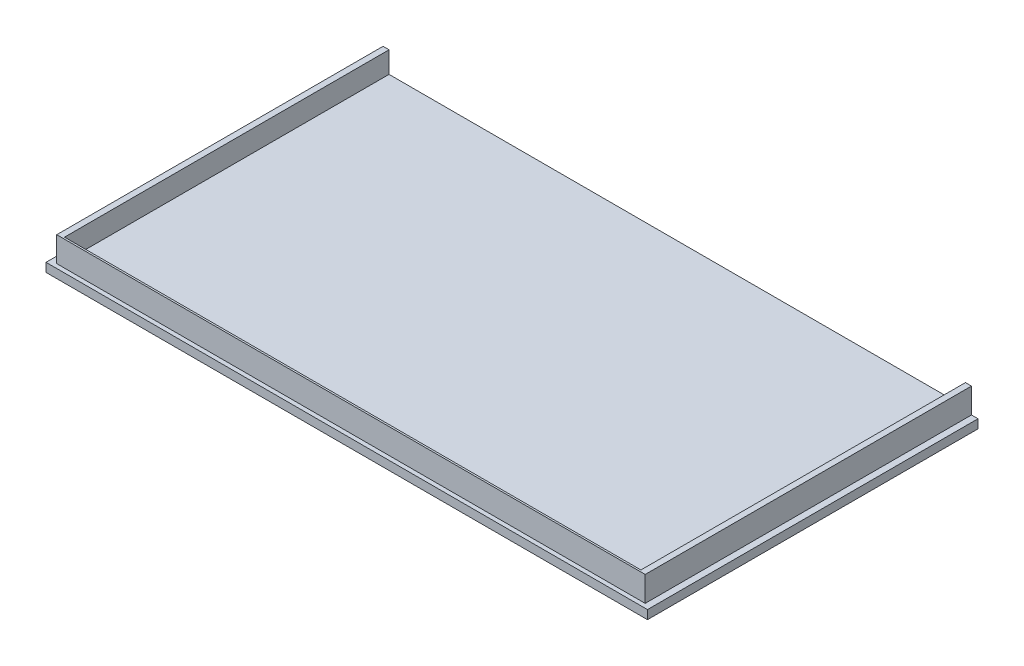
ISO-10303-21;
HEADER;
FILE_DESCRIPTION(('STEP AP214'),'2;1');
FILE_NAME('part.step','',(''),(''),'','','');
FILE_SCHEMA(('AUTOMOTIVE_DESIGN { 1 0 10303 214 1 1 1 1 }'));
ENDSEC;
DATA;
#1=APPLICATION_CONTEXT('core data for automotive mechanical design processes');
#2=APPLICATION_PROTOCOL_DEFINITION('international standard','automotive_design',2000,#1);
#3=PRODUCT_CONTEXT('',#1,'mechanical');
#4=PRODUCT('Part','Part','',(#3));
#5=PRODUCT_RELATED_PRODUCT_CATEGORY('part','',(#4));
#6=PRODUCT_DEFINITION_FORMATION('','',#4);
#7=PRODUCT_DEFINITION_CONTEXT('part definition',#1,'design');
#8=PRODUCT_DEFINITION('design','',#6,#7);
#9=PRODUCT_DEFINITION_SHAPE('','',#8);
#10=(LENGTH_UNIT() NAMED_UNIT(*) SI_UNIT(.MILLI.,.METRE.));
#11=(NAMED_UNIT(*) PLANE_ANGLE_UNIT() SI_UNIT($,.RADIAN.));
#12=(NAMED_UNIT(*) SI_UNIT($,.STERADIAN.) SOLID_ANGLE_UNIT());
#13=UNCERTAINTY_MEASURE_WITH_UNIT(LENGTH_MEASURE(1.E-05),#10,'distance_accuracy_value','');
#14=(GEOMETRIC_REPRESENTATION_CONTEXT(3) GLOBAL_UNCERTAINTY_ASSIGNED_CONTEXT((#13)) GLOBAL_UNIT_ASSIGNED_CONTEXT((#10,
#11,#12)) REPRESENTATION_CONTEXT('',''));
#15=CARTESIAN_POINT('',(0.,0.,0.));
#16=DIRECTION('',(0.,0.,1.));
#17=DIRECTION('',(1.,0.,0.));
#18=AXIS2_PLACEMENT_3D('',#15,#16,#17);
#19=CARTESIAN_POINT('',(-98.176553254438,21.,77.3984467455621));
#20=DIRECTION('',(1.,0.,0.));
#21=DIRECTION('',(0.,0.,-1.));
#22=AXIS2_PLACEMENT_3D('',#19,#20,#21);
#23=PLANE('',#22);
#24=DIRECTION('',(0.,-1.,0.));
#25=VECTOR('',#24,1.);
#26=CARTESIAN_POINT('',(-98.176553254438,21.,77.3984467455621));
#27=LINE('',#26,#25);
#28=CARTESIAN_POINT('',(-98.176553254438,3.5,77.3984467455621));
#29=VERTEX_POINT('',#28);
#30=CARTESIAN_POINT('',(-98.176553254438,0.,77.3984467455621));
#31=VERTEX_POINT('',#30);
#32=EDGE_CURVE('E41',#29,#31,#27,.T.);
#33=ORIENTED_EDGE('',*,*,#32,.F.);
#34=DIRECTION('',(0.,0.,1.));
#35=VECTOR('',#34,1.);
#36=CARTESIAN_POINT('',(-98.176553254438,3.5,77.3984467455621));
#37=LINE('',#36,#35);
#38=CARTESIAN_POINT('',(-98.176553254438,3.5,-54.4815532544379));
#39=VERTEX_POINT('',#38);
#40=EDGE_CURVE('E331',#39,#29,#37,.T.);
#41=ORIENTED_EDGE('',*,*,#40,.F.);
#42=DIRECTION('',(0.,-1.,0.));
#43=VECTOR('',#42,1.);
#44=CARTESIAN_POINT('',(-98.176553254438,21.,-54.4815532544379));
#45=LINE('',#44,#43);
#46=CARTESIAN_POINT('',(-98.176553254438,0.,-54.4815532544379));
#47=VERTEX_POINT('',#46);
#48=EDGE_CURVE('E182',#39,#47,#45,.T.);
#49=ORIENTED_EDGE('',*,*,#48,.T.);
#50=DIRECTION('',(0.,0.,1.));
#51=VECTOR('',#50,1.);
#52=CARTESIAN_POINT('',(-98.176553254438,0.,77.3984467455621));
#53=LINE('',#52,#51);
#54=EDGE_CURVE('E184',#47,#31,#53,.T.);
#55=ORIENTED_EDGE('',*,*,#54,.T.);
#56=EDGE_LOOP('',(#33,#41,#49,#55));
#57=FACE_BOUND('',#56,.T.);
#58=ADVANCED_FACE('F34',(#57),#23,.F.);
#59=CARTESIAN_POINT('',(-98.176553254438,21.,77.3984467455621));
#60=DIRECTION('',(0.,0.,-1.));
#61=DIRECTION('',(-1.,0.,0.));
#62=AXIS2_PLACEMENT_3D('',#59,#60,#61);
#63=PLANE('',#62);
#64=DIRECTION('',(0.,-1.,0.));
#65=VECTOR('',#64,1.);
#66=CARTESIAN_POINT('',(141.823446745562,21.,77.3984467455622));
#67=LINE('',#66,#65);
#68=CARTESIAN_POINT('',(141.823446745562,3.5,77.3984467455622));
#69=VERTEX_POINT('',#68);
#70=CARTESIAN_POINT('',(141.823446745562,0.,77.3984467455622));
#71=VERTEX_POINT('',#70);
#72=EDGE_CURVE('E193',#69,#71,#67,.T.);
#73=ORIENTED_EDGE('',*,*,#72,.F.);
#74=DIRECTION('',(1.,0.,0.));
#75=VECTOR('',#74,1.);
#76=CARTESIAN_POINT('',(141.823446745562,3.5,77.3984467455622));
#77=LINE('',#76,#75);
#78=EDGE_CURVE('E146',#29,#69,#77,.T.);
#79=ORIENTED_EDGE('',*,*,#78,.F.);
#80=ORIENTED_EDGE('',*,*,#32,.T.);
#81=DIRECTION('',(1.,0.,0.));
#82=VECTOR('',#81,1.);
#83=CARTESIAN_POINT('',(-98.176553254438,0.,77.3984467455621));
#84=LINE('',#83,#82);
#85=EDGE_CURVE('E187',#31,#71,#84,.T.);
#86=ORIENTED_EDGE('',*,*,#85,.T.);
#87=EDGE_LOOP('',(#73,#79,#80,#86));
#88=FACE_BOUND('',#87,.T.);
#89=ADVANCED_FACE('F198',(#88),#63,.F.);
#90=CARTESIAN_POINT('',(141.823446745562,21.,77.3984467455622));
#91=DIRECTION('',(-1.,0.,0.));
#92=DIRECTION('',(0.,0.,1.));
#93=AXIS2_PLACEMENT_3D('',#90,#91,#92);
#94=PLANE('',#93);
#95=DIRECTION('',(0.,1.,0.));
#96=VECTOR('',#95,1.);
#97=CARTESIAN_POINT('',(141.823446745562,21.,-54.4815532544379));
#98=LINE('',#97,#96);
#99=CARTESIAN_POINT('',(141.823446745562,0.,-54.4815532544379));
#100=VERTEX_POINT('',#99);
#101=CARTESIAN_POINT('',(141.823446745562,3.5,-54.4815532544379));
#102=VERTEX_POINT('',#101);
#103=EDGE_CURVE('E55',#100,#102,#98,.T.);
#104=ORIENTED_EDGE('',*,*,#103,.T.);
#105=DIRECTION('',(0.,0.,-1.));
#106=VECTOR('',#105,1.);
#107=CARTESIAN_POINT('',(141.823446745562,3.5,-54.4815532544379));
#108=LINE('',#107,#106);
#109=EDGE_CURVE('E134',#69,#102,#108,.T.);
#110=ORIENTED_EDGE('',*,*,#109,.F.);
#111=ORIENTED_EDGE('',*,*,#72,.T.);
#112=DIRECTION('',(0.,0.,-1.));
#113=VECTOR('',#112,1.);
#114=CARTESIAN_POINT('',(141.823446745562,0.,77.3984467455622));
#115=LINE('',#114,#113);
#116=EDGE_CURVE('E190',#71,#100,#115,.T.);
#117=ORIENTED_EDGE('',*,*,#116,.T.);
#118=EDGE_LOOP('',(#104,#110,#111,#117));
#119=FACE_BOUND('',#118,.T.);
#120=ADVANCED_FACE('F208',(#119),#94,.F.);
#121=CARTESIAN_POINT('',(0.,0.,0.));
#122=DIRECTION('',(0.,-1.,0.));
#123=DIRECTION('',(0.,0.,-1.));
#124=AXIS2_PLACEMENT_3D('',#121,#122,#123);
#125=PLANE('',#124);
#126=DIRECTION('',(-1.,0.,0.));
#127=VECTOR('',#126,1.);
#128=CARTESIAN_POINT('',(0.,0.,-54.4815532544379));
#129=LINE('',#128,#127);
#130=EDGE_CURVE('E11',#100,#47,#129,.T.);
#131=ORIENTED_EDGE('',*,*,#130,.F.);
#132=ORIENTED_EDGE('',*,*,#116,.F.);
#133=ORIENTED_EDGE('',*,*,#85,.F.);
#134=ORIENTED_EDGE('',*,*,#54,.F.);
#135=EDGE_LOOP('',(#131,#132,#133,#134));
#136=FACE_BOUND('',#135,.T.);
#137=ADVANCED_FACE('F206',(#136),#125,.T.);
#138=CARTESIAN_POINT('',(0.,0.,-54.4815532544379));
#139=DIRECTION('',(0.,0.,1.));
#140=DIRECTION('',(1.,0.,0.));
#141=AXIS2_PLACEMENT_3D('',#138,#139,#140);
#142=PLANE('',#141);
#143=DIRECTION('',(-1.,0.,0.));
#144=VECTOR('',#143,1.);
#145=CARTESIAN_POINT('',(-98.176553254438,3.5,-54.4815532544379));
#146=LINE('',#145,#144);
#147=CARTESIAN_POINT('',(-95.576553254438,3.5,-54.4815532544379));
#148=VERTEX_POINT('',#147);
#149=EDGE_CURVE('E333',#148,#39,#146,.T.);
#150=ORIENTED_EDGE('',*,*,#149,.F.);
#151=DIRECTION('',(0.,1.,0.));
#152=VECTOR('',#151,1.);
#153=CARTESIAN_POINT('',(-95.576553254438,3.5,-54.4815532544379));
#154=LINE('',#153,#152);
#155=CARTESIAN_POINT('',(-95.576553254438,13.5,-54.4815532544379));
#156=VERTEX_POINT('',#155);
#157=EDGE_CURVE('E152',#148,#156,#154,.T.);
#158=ORIENTED_EDGE('',*,*,#157,.T.);
#159=DIRECTION('',(1.,0.,0.));
#160=VECTOR('',#159,1.);
#161=CARTESIAN_POINT('',(0.,13.5,-54.4815532544379));
#162=LINE('',#161,#160);
#163=CARTESIAN_POINT('',(-93.176553254438,13.5,-54.4815532544379));
#164=VERTEX_POINT('',#163);
#165=EDGE_CURVE('E150',#156,#164,#162,.T.);
#166=ORIENTED_EDGE('',*,*,#165,.T.);
#167=DIRECTION('',(0.,-1.,0.));
#168=VECTOR('',#167,1.);
#169=CARTESIAN_POINT('',(-93.176553254438,13.5,-54.4815532544379));
#170=LINE('',#169,#168);
#171=CARTESIAN_POINT('',(-93.176553254438,5.,-54.4815532544379));
#172=VERTEX_POINT('',#171);
#173=EDGE_CURVE('E171',#164,#172,#170,.T.);
#174=ORIENTED_EDGE('',*,*,#173,.T.);
#175=DIRECTION('',(1.,0.,0.));
#176=VECTOR('',#175,1.);
#177=CARTESIAN_POINT('',(-98.176553254438,5.,-54.4815532544379));
#178=LINE('',#177,#176);
#179=CARTESIAN_POINT('',(136.823446745562,5.,-54.4815532544379));
#180=VERTEX_POINT('',#179);
#181=EDGE_CURVE('E173',#172,#180,#178,.T.);
#182=ORIENTED_EDGE('',*,*,#181,.T.);
#183=DIRECTION('',(0.,1.,0.));
#184=VECTOR('',#183,1.);
#185=CARTESIAN_POINT('',(136.823446745562,5.,-54.4815532544379));
#186=LINE('',#185,#184);
#187=CARTESIAN_POINT('',(136.823446745562,13.5,-54.4815532544379));
#188=VERTEX_POINT('',#187);
#189=EDGE_CURVE('E156',#180,#188,#186,.T.);
#190=ORIENTED_EDGE('',*,*,#189,.T.);
#191=CARTESIAN_POINT('',(139.223446745562,13.5,-54.4815532544379));
#192=VERTEX_POINT('',#191);
#193=EDGE_CURVE('E142',#188,#192,#162,.T.);
#194=ORIENTED_EDGE('',*,*,#193,.T.);
#195=DIRECTION('',(0.,1.,0.));
#196=VECTOR('',#195,1.);
#197=CARTESIAN_POINT('',(139.223446745562,3.5,-54.4815532544379));
#198=LINE('',#197,#196);
#199=CARTESIAN_POINT('',(139.223446745562,3.5,-54.4815532544379));
#200=VERTEX_POINT('',#199);
#201=EDGE_CURVE('E48',#200,#192,#198,.T.);
#202=ORIENTED_EDGE('',*,*,#201,.F.);
#203=DIRECTION('',(-1.,0.,0.));
#204=VECTOR('',#203,1.);
#205=CARTESIAN_POINT('',(139.223446745562,3.5,-54.4815532544379));
#206=LINE('',#205,#204);
#207=EDGE_CURVE('E130',#102,#200,#206,.T.);
#208=ORIENTED_EDGE('',*,*,#207,.F.);
#209=ORIENTED_EDGE('',*,*,#103,.F.);
#210=ORIENTED_EDGE('',*,*,#130,.T.);
#211=ORIENTED_EDGE('',*,*,#48,.F.);
#212=EDGE_LOOP('',(#150,#158,#166,#174,#182,#190,#194,#202,#208,#209,#210,#211));
#213=FACE_BOUND('',#212,.T.);
#214=ADVANCED_FACE('F139',(#213),#142,.F.);
#215=CARTESIAN_POINT('',(0.,0.,75.0184467455621));
#216=DIRECTION('',(0.,0.,-1.));
#217=DIRECTION('',(-1.,0.,0.));
#218=AXIS2_PLACEMENT_3D('',#215,#216,#217);
#219=PLANE('',#218);
#220=DIRECTION('',(0.,-1.,0.));
#221=VECTOR('',#220,1.);
#222=CARTESIAN_POINT('',(136.823446745562,13.5,75.0184467455621));
#223=LINE('',#222,#221);
#224=CARTESIAN_POINT('',(136.823446745562,13.5,75.0184467455621));
#225=VERTEX_POINT('',#224);
#226=CARTESIAN_POINT('',(136.823446745562,5.,75.0184467455621));
#227=VERTEX_POINT('',#226);
#228=EDGE_CURVE('E160',#225,#227,#223,.T.);
#229=ORIENTED_EDGE('',*,*,#228,.T.);
#230=DIRECTION('',(-1.,0.,0.));
#231=VECTOR('',#230,1.);
#232=CARTESIAN_POINT('',(141.823446745562,5.,75.0184467455621));
#233=LINE('',#232,#231);
#234=CARTESIAN_POINT('',(-93.176553254438,5.,75.0184467455621));
#235=VERTEX_POINT('',#234);
#236=EDGE_CURVE('E176',#227,#235,#233,.T.);
#237=ORIENTED_EDGE('',*,*,#236,.T.);
#238=DIRECTION('',(0.,1.,0.));
#239=VECTOR('',#238,1.);
#240=CARTESIAN_POINT('',(-93.176553254438,5.,75.0184467455621));
#241=LINE('',#240,#239);
#242=CARTESIAN_POINT('',(-93.1765532544381,13.5,75.0184467455621));
#243=VERTEX_POINT('',#242);
#244=EDGE_CURVE('E165',#235,#243,#241,.T.);
#245=ORIENTED_EDGE('',*,*,#244,.T.);
#246=DIRECTION('',(1.,0.,0.));
#247=VECTOR('',#246,1.);
#248=CARTESIAN_POINT('',(-98.176553254438,13.5,75.0184467455621));
#249=LINE('',#248,#247);
#250=EDGE_CURVE('E178',#243,#225,#249,.T.);
#251=ORIENTED_EDGE('',*,*,#250,.T.);
#252=EDGE_LOOP('',(#229,#237,#245,#251));
#253=FACE_BOUND('',#252,.T.);
#254=ADVANCED_FACE('F238',(#253),#219,.T.);
#255=CARTESIAN_POINT('',(0.,5.,129.5));
#256=DIRECTION('',(0.,-1.,0.));
#257=DIRECTION('',(0.,0.,-1.));
#258=AXIS2_PLACEMENT_3D('',#255,#256,#257);
#259=PLANE('',#258);
#260=ORIENTED_EDGE('',*,*,#181,.F.);
#261=DIRECTION('',(0.,0.,1.));
#262=VECTOR('',#261,1.);
#263=CARTESIAN_POINT('',(-93.176553254438,5.,-54.4815532544379));
#264=LINE('',#263,#262);
#265=EDGE_CURVE('E162',#172,#235,#264,.T.);
#266=ORIENTED_EDGE('',*,*,#265,.T.);
#267=ORIENTED_EDGE('',*,*,#236,.F.);
#268=DIRECTION('',(0.,0.,-1.));
#269=VECTOR('',#268,1.);
#270=CARTESIAN_POINT('',(136.823446745562,5.,75.0184467455621));
#271=LINE('',#270,#269);
#272=EDGE_CURVE('E153',#227,#180,#271,.T.);
#273=ORIENTED_EDGE('',*,*,#272,.T.);
#274=EDGE_LOOP('',(#260,#266,#267,#273));
#275=FACE_BOUND('',#274,.T.);
#276=ADVANCED_FACE('F299',(#275),#259,.F.);
#277=CARTESIAN_POINT('',(-93.176553254438,0.,129.5));
#278=DIRECTION('',(-1.,0.,0.));
#279=DIRECTION('',(0.,0.,1.));
#280=AXIS2_PLACEMENT_3D('',#277,#278,#279);
#281=PLANE('',#280);
#282=ORIENTED_EDGE('',*,*,#173,.F.);
#283=DIRECTION('',(0.,0.,-1.));
#284=VECTOR('',#283,1.);
#285=CARTESIAN_POINT('',(-93.176553254438,13.5,75.0184467455621));
#286=LINE('',#285,#284);
#287=EDGE_CURVE('E168',#243,#164,#286,.T.);
#288=ORIENTED_EDGE('',*,*,#287,.F.);
#289=ORIENTED_EDGE('',*,*,#244,.F.);
#290=ORIENTED_EDGE('',*,*,#265,.F.);
#291=EDGE_LOOP('',(#282,#288,#289,#290));
#292=FACE_BOUND('',#291,.T.);
#293=ADVANCED_FACE('F295',(#292),#281,.F.);
#294=CARTESIAN_POINT('',(136.823446745562,0.,129.5));
#295=DIRECTION('',(1.,0.,0.));
#296=DIRECTION('',(0.,0.,-1.));
#297=AXIS2_PLACEMENT_3D('',#294,#295,#296);
#298=PLANE('',#297);
#299=ORIENTED_EDGE('',*,*,#228,.F.);
#300=DIRECTION('',(0.,0.,1.));
#301=VECTOR('',#300,1.);
#302=CARTESIAN_POINT('',(136.823446745562,13.5,-54.4815532544379));
#303=LINE('',#302,#301);
#304=EDGE_CURVE('E158',#188,#225,#303,.T.);
#305=ORIENTED_EDGE('',*,*,#304,.F.);
#306=ORIENTED_EDGE('',*,*,#189,.F.);
#307=ORIENTED_EDGE('',*,*,#272,.F.);
#308=EDGE_LOOP('',(#299,#305,#306,#307));
#309=FACE_BOUND('',#308,.T.);
#310=ADVANCED_FACE('F251',(#309),#298,.F.);
#311=CARTESIAN_POINT('',(0.,13.5,0.));
#312=DIRECTION('',(0.,-1.,0.));
#313=DIRECTION('',(0.,0.,-1.));
#314=AXIS2_PLACEMENT_3D('',#311,#312,#313);
#315=PLANE('',#314);
#316=ORIENTED_EDGE('',*,*,#165,.F.);
#317=DIRECTION('',(0.,0.,-1.));
#318=VECTOR('',#317,1.);
#319=CARTESIAN_POINT('',(-95.576553254438,13.5,75.7184467455622));
#320=LINE('',#319,#318);
#321=CARTESIAN_POINT('',(-95.576553254438,13.5,75.7184467455622));
#322=VERTEX_POINT('',#321);
#323=EDGE_CURVE('E135',#322,#156,#320,.T.);
#324=ORIENTED_EDGE('',*,*,#323,.F.);
#325=DIRECTION('',(-1.,0.,0.));
#326=VECTOR('',#325,1.);
#327=CARTESIAN_POINT('',(139.223446745562,13.5,75.7184467455621));
#328=LINE('',#327,#326);
#329=CARTESIAN_POINT('',(139.223446745562,13.5,75.7184467455621));
#330=VERTEX_POINT('',#329);
#331=EDGE_CURVE('E321',#330,#322,#328,.T.);
#332=ORIENTED_EDGE('',*,*,#331,.F.);
#333=DIRECTION('',(0.,0.,1.));
#334=VECTOR('',#333,1.);
#335=CARTESIAN_POINT('',(139.223446745562,13.5,-54.4815532544379));
#336=LINE('',#335,#334);
#337=EDGE_CURVE('E317',#192,#330,#336,.T.);
#338=ORIENTED_EDGE('',*,*,#337,.F.);
#339=ORIENTED_EDGE('',*,*,#193,.F.);
#340=ORIENTED_EDGE('',*,*,#304,.T.);
#341=ORIENTED_EDGE('',*,*,#250,.F.);
#342=ORIENTED_EDGE('',*,*,#287,.T.);
#343=EDGE_LOOP('',(#316,#324,#332,#338,#339,#340,#341,#342));
#344=FACE_BOUND('',#343,.T.);
#345=ADVANCED_FACE('F245',(#344),#315,.F.);
#346=CARTESIAN_POINT('',(-95.576553254438,3.5,75.7184467455622));
#347=DIRECTION('',(1.,0.,0.));
#348=DIRECTION('',(0.,0.,-1.));
#349=AXIS2_PLACEMENT_3D('',#346,#347,#348);
#350=PLANE('',#349);
#351=ORIENTED_EDGE('',*,*,#323,.T.);
#352=ORIENTED_EDGE('',*,*,#157,.F.);
#353=DIRECTION('',(0.,0.,-1.));
#354=VECTOR('',#353,1.);
#355=CARTESIAN_POINT('',(-95.576553254438,3.5,75.7184467455622));
#356=LINE('',#355,#354);
#357=CARTESIAN_POINT('',(-95.576553254438,3.5,75.7184467455622));
#358=VERTEX_POINT('',#357);
#359=EDGE_CURVE('E328',#358,#148,#356,.T.);
#360=ORIENTED_EDGE('',*,*,#359,.F.);
#361=DIRECTION('',(0.,1.,0.));
#362=VECTOR('',#361,1.);
#363=CARTESIAN_POINT('',(-95.576553254438,3.5,75.7184467455622));
#364=LINE('',#363,#362);
#365=EDGE_CURVE('E144',#358,#322,#364,.T.);
#366=ORIENTED_EDGE('',*,*,#365,.T.);
#367=EDGE_LOOP('',(#351,#352,#360,#366));
#368=FACE_BOUND('',#367,.T.);
#369=ADVANCED_FACE('F250',(#368),#350,.F.);
#370=CARTESIAN_POINT('',(139.223446745562,3.5,75.7184467455621));
#371=DIRECTION('',(0.,0.,-1.));
#372=DIRECTION('',(-1.,0.,0.));
#373=AXIS2_PLACEMENT_3D('',#370,#371,#372);
#374=PLANE('',#373);
#375=ORIENTED_EDGE('',*,*,#331,.T.);
#376=ORIENTED_EDGE('',*,*,#365,.F.);
#377=DIRECTION('',(-1.,0.,0.));
#378=VECTOR('',#377,1.);
#379=CARTESIAN_POINT('',(139.223446745562,3.5,75.7184467455621));
#380=LINE('',#379,#378);
#381=CARTESIAN_POINT('',(139.223446745562,3.5,75.7184467455621));
#382=VERTEX_POINT('',#381);
#383=EDGE_CURVE('E129',#382,#358,#380,.T.);
#384=ORIENTED_EDGE('',*,*,#383,.F.);
#385=DIRECTION('',(0.,1.,0.));
#386=VECTOR('',#385,1.);
#387=CARTESIAN_POINT('',(139.223446745562,3.5,75.7184467455621));
#388=LINE('',#387,#386);
#389=EDGE_CURVE('E125',#382,#330,#388,.T.);
#390=ORIENTED_EDGE('',*,*,#389,.T.);
#391=EDGE_LOOP('',(#375,#376,#384,#390));
#392=FACE_BOUND('',#391,.T.);
#393=ADVANCED_FACE('F263',(#392),#374,.F.);
#394=CARTESIAN_POINT('',(139.223446745562,3.5,-54.4815532544379));
#395=DIRECTION('',(-1.,0.,0.));
#396=DIRECTION('',(0.,0.,1.));
#397=AXIS2_PLACEMENT_3D('',#394,#395,#396);
#398=PLANE('',#397);
#399=ORIENTED_EDGE('',*,*,#337,.T.);
#400=ORIENTED_EDGE('',*,*,#389,.F.);
#401=DIRECTION('',(0.,0.,1.));
#402=VECTOR('',#401,1.);
#403=CARTESIAN_POINT('',(139.223446745562,3.5,-54.4815532544379));
#404=LINE('',#403,#402);
#405=EDGE_CURVE('E122',#200,#382,#404,.T.);
#406=ORIENTED_EDGE('',*,*,#405,.F.);
#407=ORIENTED_EDGE('',*,*,#201,.T.);
#408=EDGE_LOOP('',(#399,#400,#406,#407));
#409=FACE_BOUND('',#408,.T.);
#410=ADVANCED_FACE('F124',(#409),#398,.F.);
#411=CARTESIAN_POINT('',(0.,3.5,0.));
#412=DIRECTION('',(0.,-1.,0.));
#413=DIRECTION('',(0.,0.,-1.));
#414=AXIS2_PLACEMENT_3D('',#411,#412,#413);
#415=PLANE('',#414);
#416=ORIENTED_EDGE('',*,*,#207,.T.);
#417=ORIENTED_EDGE('',*,*,#405,.T.);
#418=ORIENTED_EDGE('',*,*,#383,.T.);
#419=ORIENTED_EDGE('',*,*,#359,.T.);
#420=ORIENTED_EDGE('',*,*,#149,.T.);
#421=ORIENTED_EDGE('',*,*,#40,.T.);
#422=ORIENTED_EDGE('',*,*,#78,.T.);
#423=ORIENTED_EDGE('',*,*,#109,.T.);
#424=EDGE_LOOP('',(#416,#417,#418,#419,#420,#421,#422,#423));
#425=FACE_BOUND('',#424,.T.);
#426=ADVANCED_FACE('F132',(#425),#415,.F.);
#427=CLOSED_SHELL('',(#58,#89,#120,#137,#214,#254,#276,#293,#310,#345,#369,#393,#410,#426));
#428=MANIFOLD_SOLID_BREP('B2',#427);
#429=ADVANCED_BREP_SHAPE_REPRESENTATION('',(#18,#428),#14);
#430=SHAPE_DEFINITION_REPRESENTATION(#9,#429);
ENDSEC;
END-ISO-10303-21;
